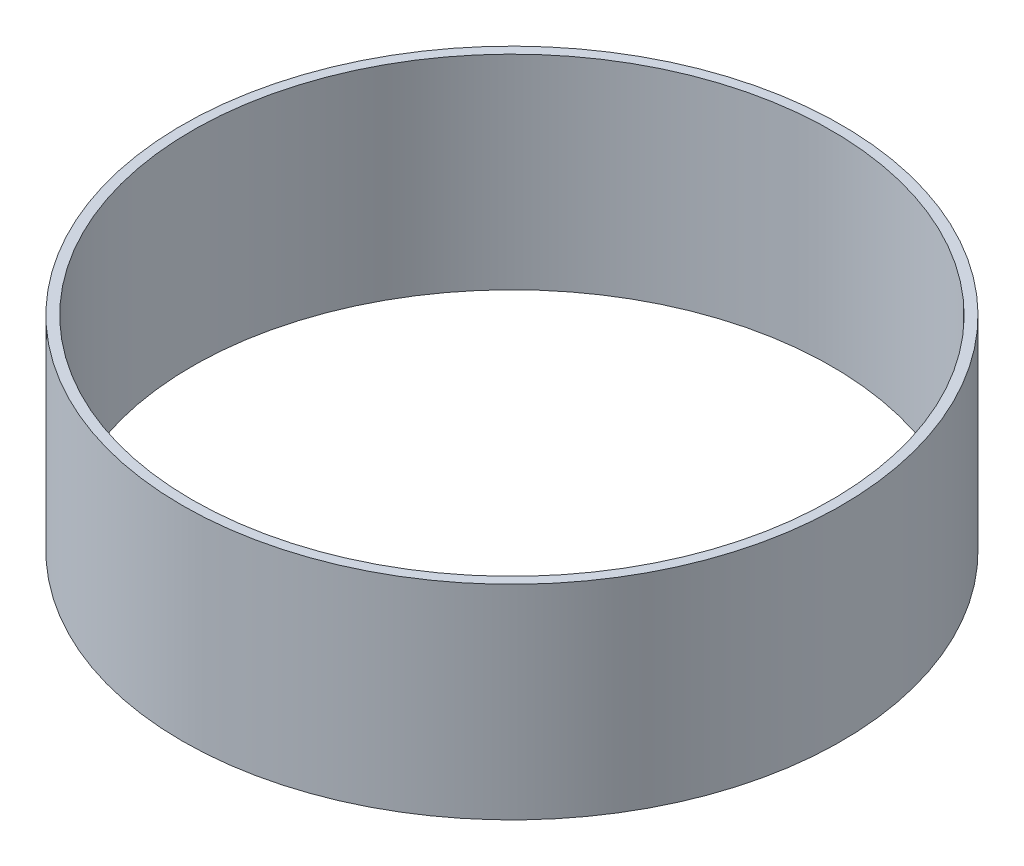
ISO-10303-21;
HEADER;
FILE_DESCRIPTION(('STEP AP214'),'2;1');
FILE_NAME('part.step','',(''),(''),'','','');
FILE_SCHEMA(('AUTOMOTIVE_DESIGN { 1 0 10303 214 1 1 1 1 }'));
ENDSEC;
DATA;
#1=APPLICATION_CONTEXT('core data for automotive mechanical design processes');
#2=APPLICATION_PROTOCOL_DEFINITION('international standard','automotive_design',2000,#1);
#3=PRODUCT_CONTEXT('',#1,'mechanical');
#4=PRODUCT('Part','Part','',(#3));
#5=PRODUCT_RELATED_PRODUCT_CATEGORY('part','',(#4));
#6=PRODUCT_DEFINITION_FORMATION('','',#4);
#7=PRODUCT_DEFINITION_CONTEXT('part definition',#1,'design');
#8=PRODUCT_DEFINITION('design','',#6,#7);
#9=PRODUCT_DEFINITION_SHAPE('','',#8);
#10=(LENGTH_UNIT() NAMED_UNIT(*) SI_UNIT(.MILLI.,.METRE.));
#11=(NAMED_UNIT(*) PLANE_ANGLE_UNIT() SI_UNIT($,.RADIAN.));
#12=(NAMED_UNIT(*) SI_UNIT($,.STERADIAN.) SOLID_ANGLE_UNIT());
#13=UNCERTAINTY_MEASURE_WITH_UNIT(LENGTH_MEASURE(1.E-05),#10,'distance_accuracy_value','');
#14=(GEOMETRIC_REPRESENTATION_CONTEXT(3) GLOBAL_UNCERTAINTY_ASSIGNED_CONTEXT((#13)) GLOBAL_UNIT_ASSIGNED_CONTEXT((#10,
#11,#12)) REPRESENTATION_CONTEXT('',''));
#15=CARTESIAN_POINT('',(0.,0.,0.));
#16=DIRECTION('',(0.,0.,1.));
#17=DIRECTION('',(1.,0.,0.));
#18=AXIS2_PLACEMENT_3D('',#15,#16,#17);
#19=CARTESIAN_POINT('',(0.,-25.,0.));
#20=DIRECTION('',(0.,1.,0.));
#21=DIRECTION('',(0.,0.,1.));
#22=AXIS2_PLACEMENT_3D('',#19,#20,#21);
#23=CYLINDRICAL_SURFACE('',#22,80.75);
#24=CARTESIAN_POINT('',(0.,-25.,0.));
#25=DIRECTION('',(0.,1.,0.));
#26=DIRECTION('',(0.,0.,1.));
#27=AXIS2_PLACEMENT_3D('',#24,#25,#26);
#28=CIRCLE('',#27,80.75);
#29=CARTESIAN_POINT('',(0.,-25.,80.75));
#30=VERTEX_POINT('',#29);
#31=EDGE_CURVE('E10',#30,#30,#28,.T.);
#32=ORIENTED_EDGE('',*,*,#31,.T.);
#33=EDGE_LOOP('',(#32));
#34=FACE_BOUND('',#33,.T.);
#35=CARTESIAN_POINT('',(0.,25.,0.));
#36=DIRECTION('',(0.,1.,0.));
#37=DIRECTION('',(0.,0.,1.));
#38=AXIS2_PLACEMENT_3D('',#35,#36,#37);
#39=CIRCLE('',#38,80.75);
#40=CARTESIAN_POINT('',(0.,25.,80.75));
#41=VERTEX_POINT('',#40);
#42=EDGE_CURVE('E44',#41,#41,#39,.T.);
#43=ORIENTED_EDGE('',*,*,#42,.F.);
#44=EDGE_LOOP('',(#43));
#45=FACE_BOUND('',#44,.T.);
#46=ADVANCED_FACE('F34',(#34,#45),#23,.T.);
#47=CARTESIAN_POINT('',(0.,-25.,0.));
#48=DIRECTION('',(0.,1.,0.));
#49=DIRECTION('',(0.,0.,1.));
#50=AXIS2_PLACEMENT_3D('',#47,#48,#49);
#51=PLANE('',#50);
#52=CARTESIAN_POINT('',(0.,-25.,0.));
#53=DIRECTION('',(0.,1.,0.));
#54=DIRECTION('',(0.,0.,1.));
#55=AXIS2_PLACEMENT_3D('',#52,#53,#54);
#56=CIRCLE('',#55,78.35);
#57=CARTESIAN_POINT('',(0.,-25.,78.35));
#58=VERTEX_POINT('',#57);
#59=EDGE_CURVE('E40',#58,#58,#56,.T.);
#60=ORIENTED_EDGE('',*,*,#59,.T.);
#61=EDGE_LOOP('',(#60));
#62=FACE_BOUND('',#61,.T.);
#63=ORIENTED_EDGE('',*,*,#31,.F.);
#64=EDGE_LOOP('',(#63));
#65=FACE_BOUND('',#64,.T.);
#66=ADVANCED_FACE('F63',(#62,#65),#51,.F.);
#67=CARTESIAN_POINT('',(0.,-25.,0.));
#68=DIRECTION('',(0.,1.,0.));
#69=DIRECTION('',(0.,0.,1.));
#70=AXIS2_PLACEMENT_3D('',#67,#68,#69);
#71=CYLINDRICAL_SURFACE('',#70,78.35);
#72=ORIENTED_EDGE('',*,*,#59,.F.);
#73=EDGE_LOOP('',(#72));
#74=FACE_BOUND('',#73,.T.);
#75=CARTESIAN_POINT('',(0.,25.,0.));
#76=DIRECTION('',(0.,1.,0.));
#77=DIRECTION('',(0.,0.,1.));
#78=AXIS2_PLACEMENT_3D('',#75,#76,#77);
#79=CIRCLE('',#78,78.35);
#80=CARTESIAN_POINT('',(0.,25.,78.35));
#81=VERTEX_POINT('',#80);
#82=EDGE_CURVE('E48',#81,#81,#79,.T.);
#83=ORIENTED_EDGE('',*,*,#82,.T.);
#84=EDGE_LOOP('',(#83));
#85=FACE_BOUND('',#84,.T.);
#86=ADVANCED_FACE('F54',(#74,#85),#71,.F.);
#87=CARTESIAN_POINT('',(0.,25.,0.));
#88=DIRECTION('',(0.,1.,0.));
#89=DIRECTION('',(0.,0.,1.));
#90=AXIS2_PLACEMENT_3D('',#87,#88,#89);
#91=PLANE('',#90);
#92=ORIENTED_EDGE('',*,*,#42,.T.);
#93=EDGE_LOOP('',(#92));
#94=FACE_BOUND('',#93,.T.);
#95=ORIENTED_EDGE('',*,*,#82,.F.);
#96=EDGE_LOOP('',(#95));
#97=FACE_BOUND('',#96,.T.);
#98=ADVANCED_FACE('F56',(#94,#97),#91,.T.);
#99=CLOSED_SHELL('',(#46,#66,#86,#98));
#100=MANIFOLD_SOLID_BREP('B2',#99);
#101=ADVANCED_BREP_SHAPE_REPRESENTATION('',(#18,#100),#14);
#102=SHAPE_DEFINITION_REPRESENTATION(#9,#101);
ENDSEC;
END-ISO-10303-21;
